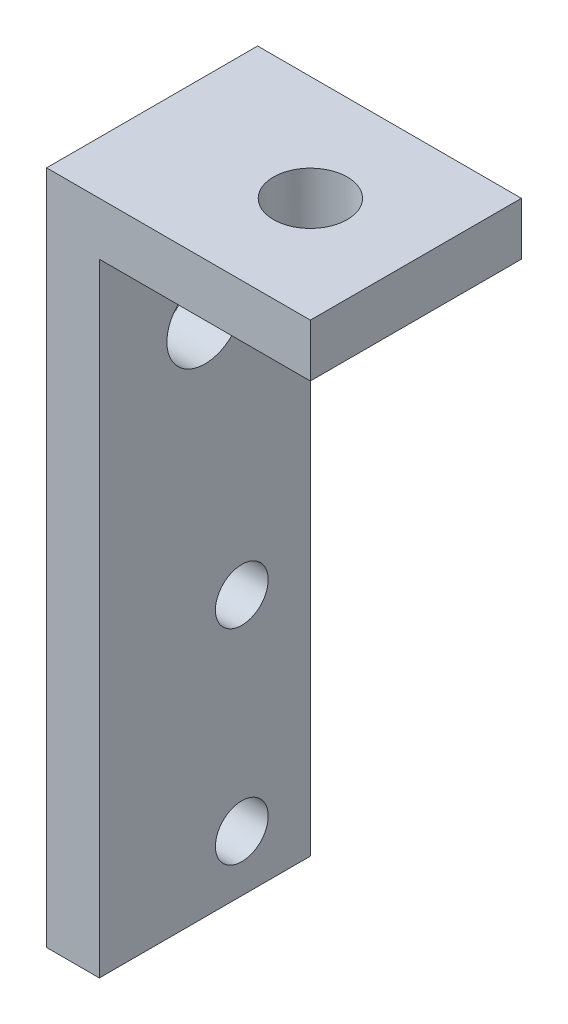
ISO-10303-21;
HEADER;
FILE_DESCRIPTION(('STEP AP214'),'2;1');
FILE_NAME('part.step','',(''),(''),'','','');
FILE_SCHEMA(('AUTOMOTIVE_DESIGN { 1 0 10303 214 1 1 1 1 }'));
ENDSEC;
DATA;
#1=APPLICATION_CONTEXT('core data for automotive mechanical design processes');
#2=APPLICATION_PROTOCOL_DEFINITION('international standard','automotive_design',2000,#1);
#3=PRODUCT_CONTEXT('',#1,'mechanical');
#4=PRODUCT('Part','Part','',(#3));
#5=PRODUCT_RELATED_PRODUCT_CATEGORY('part','',(#4));
#6=PRODUCT_DEFINITION_FORMATION('','',#4);
#7=PRODUCT_DEFINITION_CONTEXT('part definition',#1,'design');
#8=PRODUCT_DEFINITION('design','',#6,#7);
#9=PRODUCT_DEFINITION_SHAPE('','',#8);
#10=(LENGTH_UNIT() NAMED_UNIT(*) SI_UNIT(.MILLI.,.METRE.));
#11=(NAMED_UNIT(*) PLANE_ANGLE_UNIT() SI_UNIT($,.RADIAN.));
#12=(NAMED_UNIT(*) SI_UNIT($,.STERADIAN.) SOLID_ANGLE_UNIT());
#13=UNCERTAINTY_MEASURE_WITH_UNIT(LENGTH_MEASURE(1.E-05),#10,'distance_accuracy_value','');
#14=(GEOMETRIC_REPRESENTATION_CONTEXT(3) GLOBAL_UNCERTAINTY_ASSIGNED_CONTEXT((#13)) GLOBAL_UNIT_ASSIGNED_CONTEXT((#10,
#11,#12)) REPRESENTATION_CONTEXT('',''));
#15=CARTESIAN_POINT('',(0.,0.,0.));
#16=DIRECTION('',(0.,0.,1.));
#17=DIRECTION('',(1.,0.,0.));
#18=AXIS2_PLACEMENT_3D('',#15,#16,#17);
#19=CARTESIAN_POINT('',(2.5,34.,10.));
#20=DIRECTION('',(-1.,0.,0.));
#21=DIRECTION('',(0.,-1.,0.));
#22=AXIS2_PLACEMENT_3D('',#19,#20,#21);
#23=PLANE('',#22);
#24=CARTESIAN_POINT('',(2.5,7.15,3.25));
#25=DIRECTION('',(1.,0.,0.));
#26=DIRECTION('',(0.,1.,0.));
#27=AXIS2_PLACEMENT_3D('',#24,#25,#26);
#28=CIRCLE('',#27,1.25);
#29=CARTESIAN_POINT('',(2.5,8.4,3.25));
#30=VERTEX_POINT('',#29);
#31=EDGE_CURVE('E188',#30,#30,#28,.T.);
#32=ORIENTED_EDGE('',*,*,#31,.F.);
#33=EDGE_LOOP('',(#32));
#34=FACE_BOUND('',#33,.T.);
#35=CARTESIAN_POINT('',(2.5,16.85,3.25));
#36=DIRECTION('',(1.,0.,0.));
#37=DIRECTION('',(0.,-1.,0.));
#38=AXIS2_PLACEMENT_3D('',#35,#36,#37);
#39=CIRCLE('',#38,1.25);
#40=CARTESIAN_POINT('',(2.5,15.6,3.25));
#41=VERTEX_POINT('',#40);
#42=EDGE_CURVE('E180',#41,#41,#39,.T.);
#43=ORIENTED_EDGE('',*,*,#42,.F.);
#44=EDGE_LOOP('',(#43));
#45=FACE_BOUND('',#44,.T.);
#46=CARTESIAN_POINT('',(2.5,29.,5.));
#47=DIRECTION('',(1.,0.,0.));
#48=DIRECTION('',(0.,1.,0.));
#49=AXIS2_PLACEMENT_3D('',#46,#47,#48);
#50=CIRCLE('',#49,1.8);
#51=CARTESIAN_POINT('',(2.5,30.8,5.));
#52=VERTEX_POINT('',#51);
#53=EDGE_CURVE('E172',#52,#52,#50,.T.);
#54=ORIENTED_EDGE('',*,*,#53,.F.);
#55=EDGE_LOOP('',(#54));
#56=FACE_BOUND('',#55,.T.);
#57=DIRECTION('',(0.,1.,0.));
#58=VECTOR('',#57,1.);
#59=CARTESIAN_POINT('',(2.5,34.,10.));
#60=LINE('',#59,#58);
#61=CARTESIAN_POINT('',(2.5,4.5,10.));
#62=VERTEX_POINT('',#61);
#63=CARTESIAN_POINT('',(2.5,34.,10.));
#64=VERTEX_POINT('',#63);
#65=EDGE_CURVE('E92',#62,#64,#60,.T.);
#66=ORIENTED_EDGE('',*,*,#65,.F.);
#67=DIRECTION('',(0.,0.,1.));
#68=VECTOR('',#67,1.);
#69=CARTESIAN_POINT('',(2.5,4.5,0.));
#70=LINE('',#69,#68);
#71=CARTESIAN_POINT('',(2.5,4.5,0.));
#72=VERTEX_POINT('',#71);
#73=EDGE_CURVE('E103',#72,#62,#70,.T.);
#74=ORIENTED_EDGE('',*,*,#73,.F.);
#75=DIRECTION('',(0.,1.,0.));
#76=VECTOR('',#75,1.);
#77=CARTESIAN_POINT('',(2.5,34.,0.));
#78=LINE('',#77,#76);
#79=CARTESIAN_POINT('',(2.5,34.,0.));
#80=VERTEX_POINT('',#79);
#81=EDGE_CURVE('E112',#72,#80,#78,.T.);
#82=ORIENTED_EDGE('',*,*,#81,.T.);
#83=DIRECTION('',(0.,0.,-1.));
#84=VECTOR('',#83,1.);
#85=CARTESIAN_POINT('',(2.5,34.,10.));
#86=LINE('',#85,#84);
#87=EDGE_CURVE('E11',#64,#80,#86,.T.);
#88=ORIENTED_EDGE('',*,*,#87,.F.);
#89=EDGE_LOOP('',(#66,#74,#82,#88));
#90=FACE_BOUND('',#89,.T.);
#91=ADVANCED_FACE('F39',(#34,#45,#56,#90),#23,.F.);
#92=CARTESIAN_POINT('',(12.5,34.,10.));
#93=DIRECTION('',(0.,1.,0.));
#94=DIRECTION('',(0.,0.,1.));
#95=AXIS2_PLACEMENT_3D('',#92,#93,#94);
#96=PLANE('',#95);
#97=CARTESIAN_POINT('',(7.5,34.,5.));
#98=DIRECTION('',(0.,-1.,0.));
#99=DIRECTION('',(1.,0.,0.));
#100=AXIS2_PLACEMENT_3D('',#97,#98,#99);
#101=CIRCLE('',#100,1.75);
#102=CARTESIAN_POINT('',(9.25,34.,5.));
#103=VERTEX_POINT('',#102);
#104=EDGE_CURVE('E126',#103,#103,#101,.T.);
#105=ORIENTED_EDGE('',*,*,#104,.F.);
#106=EDGE_LOOP('',(#105));
#107=FACE_BOUND('',#106,.T.);
#108=DIRECTION('',(1.,0.,0.));
#109=VECTOR('',#108,1.);
#110=CARTESIAN_POINT('',(12.5,34.,0.));
#111=LINE('',#110,#109);
#112=CARTESIAN_POINT('',(12.5,34.,0.));
#113=VERTEX_POINT('',#112);
#114=EDGE_CURVE('E118',#80,#113,#111,.T.);
#115=ORIENTED_EDGE('',*,*,#114,.T.);
#116=DIRECTION('',(0.,0.,-1.));
#117=VECTOR('',#116,1.);
#118=CARTESIAN_POINT('',(12.5,34.,10.));
#119=LINE('',#118,#117);
#120=CARTESIAN_POINT('',(12.5,34.,10.));
#121=VERTEX_POINT('',#120);
#122=EDGE_CURVE('E48',#121,#113,#119,.T.);
#123=ORIENTED_EDGE('',*,*,#122,.F.);
#124=DIRECTION('',(1.,0.,0.));
#125=VECTOR('',#124,1.);
#126=CARTESIAN_POINT('',(12.5,34.,10.));
#127=LINE('',#126,#125);
#128=EDGE_CURVE('E161',#64,#121,#127,.T.);
#129=ORIENTED_EDGE('',*,*,#128,.F.);
#130=ORIENTED_EDGE('',*,*,#87,.T.);
#131=EDGE_LOOP('',(#115,#123,#129,#130));
#132=FACE_BOUND('',#131,.T.);
#133=ADVANCED_FACE('F211',(#107,#132),#96,.F.);
#134=CARTESIAN_POINT('',(12.5,36.5,10.));
#135=DIRECTION('',(-1.,0.,0.));
#136=DIRECTION('',(0.,-1.,0.));
#137=AXIS2_PLACEMENT_3D('',#134,#135,#136);
#138=PLANE('',#137);
#139=DIRECTION('',(0.,1.,0.));
#140=VECTOR('',#139,1.);
#141=CARTESIAN_POINT('',(12.5,36.5,0.));
#142=LINE('',#141,#140);
#143=CARTESIAN_POINT('',(12.5,36.5,0.));
#144=VERTEX_POINT('',#143);
#145=EDGE_CURVE('E123',#113,#144,#142,.T.);
#146=ORIENTED_EDGE('',*,*,#145,.T.);
#147=DIRECTION('',(0.,0.,-1.));
#148=VECTOR('',#147,1.);
#149=CARTESIAN_POINT('',(12.5,36.5,10.));
#150=LINE('',#149,#148);
#151=CARTESIAN_POINT('',(12.5,36.5,10.));
#152=VERTEX_POINT('',#151);
#153=EDGE_CURVE('E141',#152,#144,#150,.T.);
#154=ORIENTED_EDGE('',*,*,#153,.F.);
#155=DIRECTION('',(0.,1.,0.));
#156=VECTOR('',#155,1.);
#157=CARTESIAN_POINT('',(12.5,36.5,10.));
#158=LINE('',#157,#156);
#159=EDGE_CURVE('E151',#121,#152,#158,.T.);
#160=ORIENTED_EDGE('',*,*,#159,.F.);
#161=ORIENTED_EDGE('',*,*,#122,.T.);
#162=EDGE_LOOP('',(#146,#154,#160,#161));
#163=FACE_BOUND('',#162,.T.);
#164=ADVANCED_FACE('F149',(#163),#138,.F.);
#165=CARTESIAN_POINT('',(0.,36.5,10.));
#166=DIRECTION('',(0.,-1.,0.));
#167=DIRECTION('',(0.,0.,-1.));
#168=AXIS2_PLACEMENT_3D('',#165,#166,#167);
#169=PLANE('',#168);
#170=CARTESIAN_POINT('',(7.5,36.5,5.));
#171=DIRECTION('',(0.,-1.,0.));
#172=DIRECTION('',(0.,0.,-1.));
#173=AXIS2_PLACEMENT_3D('',#170,#171,#172);
#174=CIRCLE('',#173,1.75);
#175=CARTESIAN_POINT('',(7.5,36.5,3.25));
#176=VERTEX_POINT('',#175);
#177=EDGE_CURVE('E42',#176,#176,#174,.T.);
#178=ORIENTED_EDGE('',*,*,#177,.T.);
#179=EDGE_LOOP('',(#178));
#180=FACE_BOUND('',#179,.T.);
#181=DIRECTION('',(-1.,0.,0.));
#182=VECTOR('',#181,1.);
#183=CARTESIAN_POINT('',(0.,36.5,0.));
#184=LINE('',#183,#182);
#185=CARTESIAN_POINT('',(0.,36.5,0.));
#186=VERTEX_POINT('',#185);
#187=EDGE_CURVE('E85',#144,#186,#184,.T.);
#188=ORIENTED_EDGE('',*,*,#187,.T.);
#189=DIRECTION('',(0.,0.,-1.));
#190=VECTOR('',#189,1.);
#191=CARTESIAN_POINT('',(0.,36.5,10.));
#192=LINE('',#191,#190);
#193=CARTESIAN_POINT('',(0.,36.5,10.));
#194=VERTEX_POINT('',#193);
#195=EDGE_CURVE('E138',#194,#186,#192,.T.);
#196=ORIENTED_EDGE('',*,*,#195,.F.);
#197=DIRECTION('',(-1.,0.,0.));
#198=VECTOR('',#197,1.);
#199=CARTESIAN_POINT('',(0.,36.5,10.));
#200=LINE('',#199,#198);
#201=EDGE_CURVE('E64',#152,#194,#200,.T.);
#202=ORIENTED_EDGE('',*,*,#201,.F.);
#203=ORIENTED_EDGE('',*,*,#153,.T.);
#204=EDGE_LOOP('',(#188,#196,#202,#203));
#205=FACE_BOUND('',#204,.T.);
#206=ADVANCED_FACE('F157',(#180,#205),#169,.F.);
#207=CARTESIAN_POINT('',(0.,0.,10.));
#208=DIRECTION('',(1.,0.,0.));
#209=DIRECTION('',(0.,1.,0.));
#210=AXIS2_PLACEMENT_3D('',#207,#208,#209);
#211=PLANE('',#210);
#212=CARTESIAN_POINT('',(0.,7.15,3.25));
#213=DIRECTION('',(1.,0.,0.));
#214=DIRECTION('',(0.,1.,0.));
#215=AXIS2_PLACEMENT_3D('',#212,#213,#214);
#216=CIRCLE('',#215,1.25);
#217=CARTESIAN_POINT('',(0.,8.4,3.25));
#218=VERTEX_POINT('',#217);
#219=EDGE_CURVE('E171',#218,#218,#216,.T.);
#220=ORIENTED_EDGE('',*,*,#219,.T.);
#221=EDGE_LOOP('',(#220));
#222=FACE_BOUND('',#221,.T.);
#223=CARTESIAN_POINT('',(0.,16.85,3.25));
#224=DIRECTION('',(1.,0.,0.));
#225=DIRECTION('',(0.,-1.,0.));
#226=AXIS2_PLACEMENT_3D('',#223,#224,#225);
#227=CIRCLE('',#226,1.25);
#228=CARTESIAN_POINT('',(0.,15.6,3.25));
#229=VERTEX_POINT('',#228);
#230=EDGE_CURVE('E184',#229,#229,#227,.T.);
#231=ORIENTED_EDGE('',*,*,#230,.T.);
#232=EDGE_LOOP('',(#231));
#233=FACE_BOUND('',#232,.T.);
#234=CARTESIAN_POINT('',(0.,29.,5.));
#235=DIRECTION('',(1.,0.,0.));
#236=DIRECTION('',(0.,1.,0.));
#237=AXIS2_PLACEMENT_3D('',#234,#235,#236);
#238=CIRCLE('',#237,1.8);
#239=CARTESIAN_POINT('',(0.,30.8,5.));
#240=VERTEX_POINT('',#239);
#241=EDGE_CURVE('E176',#240,#240,#238,.T.);
#242=ORIENTED_EDGE('',*,*,#241,.T.);
#243=EDGE_LOOP('',(#242));
#244=FACE_BOUND('',#243,.T.);
#245=DIRECTION('',(0.,-1.,0.));
#246=VECTOR('',#245,1.);
#247=CARTESIAN_POINT('',(0.,0.,0.));
#248=LINE('',#247,#246);
#249=CARTESIAN_POINT('',(0.,4.5,0.));
#250=VERTEX_POINT('',#249);
#251=EDGE_CURVE('E135',#186,#250,#248,.T.);
#252=ORIENTED_EDGE('',*,*,#251,.T.);
#253=DIRECTION('',(0.,0.,1.));
#254=VECTOR('',#253,1.);
#255=CARTESIAN_POINT('',(0.,4.5,0.));
#256=LINE('',#255,#254);
#257=CARTESIAN_POINT('',(0.,4.5,10.));
#258=VERTEX_POINT('',#257);
#259=EDGE_CURVE('E55',#250,#258,#256,.T.);
#260=ORIENTED_EDGE('',*,*,#259,.T.);
#261=DIRECTION('',(0.,-1.,0.));
#262=VECTOR('',#261,1.);
#263=CARTESIAN_POINT('',(0.,0.,10.));
#264=LINE('',#263,#262);
#265=EDGE_CURVE('E128',#194,#258,#264,.T.);
#266=ORIENTED_EDGE('',*,*,#265,.F.);
#267=ORIENTED_EDGE('',*,*,#195,.T.);
#268=EDGE_LOOP('',(#252,#260,#266,#267));
#269=FACE_BOUND('',#268,.T.);
#270=ADVANCED_FACE('F155',(#222,#233,#244,#269),#211,.F.);
#271=CARTESIAN_POINT('',(0.,0.,10.));
#272=DIRECTION('',(0.,0.,-1.));
#273=DIRECTION('',(-1.,0.,0.));
#274=AXIS2_PLACEMENT_3D('',#271,#272,#273);
#275=PLANE('',#274);
#276=ORIENTED_EDGE('',*,*,#265,.T.);
#277=DIRECTION('',(1.,0.,0.));
#278=VECTOR('',#277,1.);
#279=CARTESIAN_POINT('',(0.,4.5,10.));
#280=LINE('',#279,#278);
#281=EDGE_CURVE('E109',#258,#62,#280,.T.);
#282=ORIENTED_EDGE('',*,*,#281,.T.);
#283=ORIENTED_EDGE('',*,*,#65,.T.);
#284=ORIENTED_EDGE('',*,*,#128,.T.);
#285=ORIENTED_EDGE('',*,*,#159,.T.);
#286=ORIENTED_EDGE('',*,*,#201,.T.);
#287=EDGE_LOOP('',(#276,#282,#283,#284,#285,#286));
#288=FACE_BOUND('',#287,.T.);
#289=ADVANCED_FACE('F198',(#288),#275,.F.);
#290=CARTESIAN_POINT('',(0.,0.,0.));
#291=DIRECTION('',(0.,0.,-1.));
#292=DIRECTION('',(-1.,0.,0.));
#293=AXIS2_PLACEMENT_3D('',#290,#291,#292);
#294=PLANE('',#293);
#295=DIRECTION('',(1.,0.,0.));
#296=VECTOR('',#295,1.);
#297=CARTESIAN_POINT('',(0.,4.5,0.));
#298=LINE('',#297,#296);
#299=EDGE_CURVE('E100',#250,#72,#298,.T.);
#300=ORIENTED_EDGE('',*,*,#299,.F.);
#301=ORIENTED_EDGE('',*,*,#251,.F.);
#302=ORIENTED_EDGE('',*,*,#187,.F.);
#303=ORIENTED_EDGE('',*,*,#145,.F.);
#304=ORIENTED_EDGE('',*,*,#114,.F.);
#305=ORIENTED_EDGE('',*,*,#81,.F.);
#306=EDGE_LOOP('',(#300,#301,#302,#303,#304,#305));
#307=FACE_BOUND('',#306,.T.);
#308=ADVANCED_FACE('F116',(#307),#294,.T.);
#309=CARTESIAN_POINT('',(7.49999999999999,44.,5.));
#310=DIRECTION('',(0.,-1.,0.));
#311=DIRECTION('',(1.,0.,0.));
#312=AXIS2_PLACEMENT_3D('',#309,#310,#311);
#313=CYLINDRICAL_SURFACE('',#312,1.75);
#314=ORIENTED_EDGE('',*,*,#104,.T.);
#315=EDGE_LOOP('',(#314));
#316=FACE_BOUND('',#315,.T.);
#317=ORIENTED_EDGE('',*,*,#177,.F.);
#318=EDGE_LOOP('',(#317));
#319=FACE_BOUND('',#318,.T.);
#320=ADVANCED_FACE('F205',(#316,#319),#313,.F.);
#321=CARTESIAN_POINT('',(0.,29.,5.));
#322=DIRECTION('',(1.,0.,0.));
#323=DIRECTION('',(0.,1.,0.));
#324=AXIS2_PLACEMENT_3D('',#321,#322,#323);
#325=CYLINDRICAL_SURFACE('',#324,1.8);
#326=ORIENTED_EDGE('',*,*,#241,.F.);
#327=EDGE_LOOP('',(#326));
#328=FACE_BOUND('',#327,.T.);
#329=ORIENTED_EDGE('',*,*,#53,.T.);
#330=EDGE_LOOP('',(#329));
#331=FACE_BOUND('',#330,.T.);
#332=ADVANCED_FACE('F223',(#328,#331),#325,.F.);
#333=CARTESIAN_POINT('',(0.,16.85,3.25));
#334=DIRECTION('',(1.,0.,0.));
#335=DIRECTION('',(0.,1.,0.));
#336=AXIS2_PLACEMENT_3D('',#333,#334,#335);
#337=CYLINDRICAL_SURFACE('',#336,1.25);
#338=ORIENTED_EDGE('',*,*,#230,.F.);
#339=EDGE_LOOP('',(#338));
#340=FACE_BOUND('',#339,.T.);
#341=ORIENTED_EDGE('',*,*,#42,.T.);
#342=EDGE_LOOP('',(#341));
#343=FACE_BOUND('',#342,.T.);
#344=ADVANCED_FACE('F225',(#340,#343),#337,.F.);
#345=CARTESIAN_POINT('',(0.,7.15,3.25));
#346=DIRECTION('',(1.,0.,0.));
#347=DIRECTION('',(0.,1.,0.));
#348=AXIS2_PLACEMENT_3D('',#345,#346,#347);
#349=CYLINDRICAL_SURFACE('',#348,1.25);
#350=ORIENTED_EDGE('',*,*,#219,.F.);
#351=EDGE_LOOP('',(#350));
#352=FACE_BOUND('',#351,.T.);
#353=ORIENTED_EDGE('',*,*,#31,.T.);
#354=EDGE_LOOP('',(#353));
#355=FACE_BOUND('',#354,.T.);
#356=ADVANCED_FACE('F232',(#352,#355),#349,.F.);
#357=CARTESIAN_POINT('',(0.,4.5,0.));
#358=DIRECTION('',(0.,1.,0.));
#359=DIRECTION('',(0.,0.,1.));
#360=AXIS2_PLACEMENT_3D('',#357,#358,#359);
#361=PLANE('',#360);
#362=ORIENTED_EDGE('',*,*,#259,.F.);
#363=ORIENTED_EDGE('',*,*,#299,.T.);
#364=ORIENTED_EDGE('',*,*,#73,.T.);
#365=ORIENTED_EDGE('',*,*,#281,.F.);
#366=EDGE_LOOP('',(#362,#363,#364,#365));
#367=FACE_BOUND('',#366,.T.);
#368=ADVANCED_FACE('F102',(#367),#361,.F.);
#369=CLOSED_SHELL('',(#91,#133,#164,#206,#270,#289,#308,#320,#332,#344,#356,#368));
#370=MANIFOLD_SOLID_BREP('B2',#369);
#371=ADVANCED_BREP_SHAPE_REPRESENTATION('',(#18,#370),#14);
#372=SHAPE_DEFINITION_REPRESENTATION(#9,#371);
ENDSEC;
END-ISO-10303-21;
